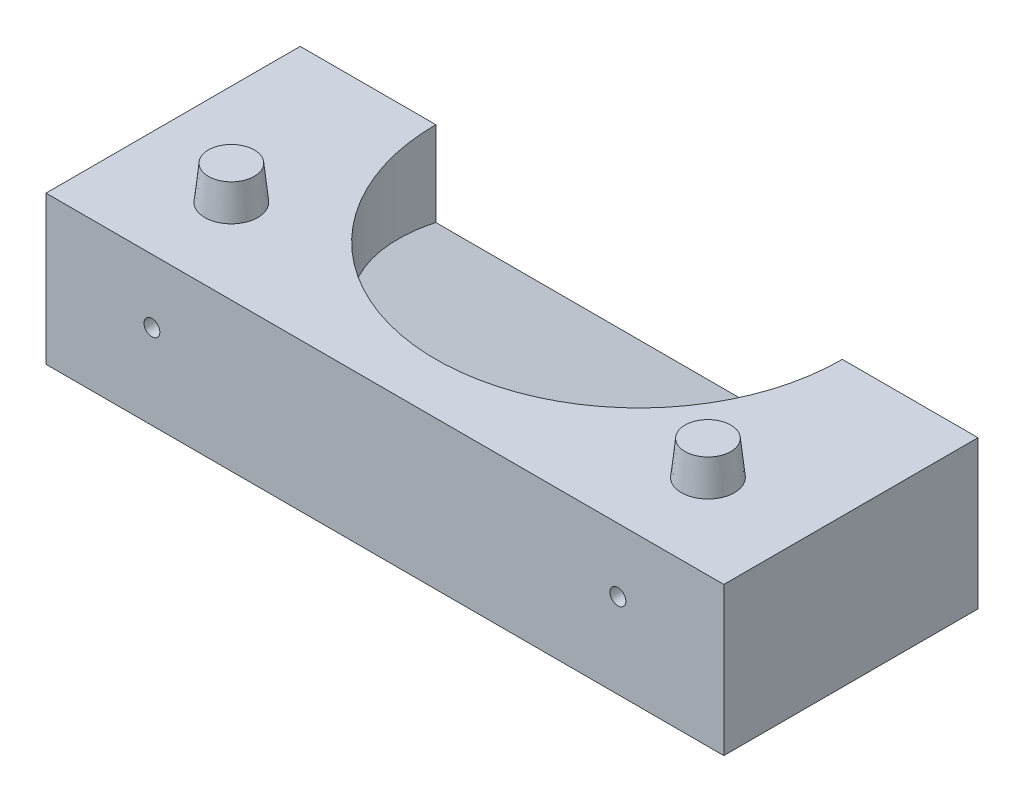
ISO-10303-21;
HEADER;
FILE_DESCRIPTION(('STEP AP214'),'2;1');
FILE_NAME('part.step','',(''),(''),'','','');
FILE_SCHEMA(('AUTOMOTIVE_DESIGN { 1 0 10303 214 1 1 1 1 }'));
ENDSEC;
DATA;
#1=APPLICATION_CONTEXT('core data for automotive mechanical design processes');
#2=APPLICATION_PROTOCOL_DEFINITION('international standard','automotive_design',2000,#1);
#3=PRODUCT_CONTEXT('',#1,'mechanical');
#4=PRODUCT('Part','Part','',(#3));
#5=PRODUCT_RELATED_PRODUCT_CATEGORY('part','',(#4));
#6=PRODUCT_DEFINITION_FORMATION('','',#4);
#7=PRODUCT_DEFINITION_CONTEXT('part definition',#1,'design');
#8=PRODUCT_DEFINITION('design','',#6,#7);
#9=PRODUCT_DEFINITION_SHAPE('','',#8);
#10=(LENGTH_UNIT() NAMED_UNIT(*) SI_UNIT(.MILLI.,.METRE.));
#11=(NAMED_UNIT(*) PLANE_ANGLE_UNIT() SI_UNIT($,.RADIAN.));
#12=(NAMED_UNIT(*) SI_UNIT($,.STERADIAN.) SOLID_ANGLE_UNIT());
#13=UNCERTAINTY_MEASURE_WITH_UNIT(LENGTH_MEASURE(1.E-05),#10,'distance_accuracy_value','');
#14=(GEOMETRIC_REPRESENTATION_CONTEXT(3) GLOBAL_UNCERTAINTY_ASSIGNED_CONTEXT((#13)) GLOBAL_UNIT_ASSIGNED_CONTEXT((#10,
#11,#12)) REPRESENTATION_CONTEXT('',''));
#15=CARTESIAN_POINT('',(0.,0.,0.));
#16=DIRECTION('',(0.,0.,1.));
#17=DIRECTION('',(1.,0.,0.));
#18=AXIS2_PLACEMENT_3D('',#15,#16,#17);
#19=CARTESIAN_POINT('',(-160.,0.,120.));
#20=DIRECTION('',(0.,-1.,0.));
#21=DIRECTION('',(0.,0.,-1.));
#22=AXIS2_PLACEMENT_3D('',#19,#20,#21);
#23=PLANE('',#22);
#24=CARTESIAN_POINT('',(112.5,0.,80.));
#25=DIRECTION('',(0.,-1.,0.));
#26=DIRECTION('',(0.,0.,-1.));
#27=AXIS2_PLACEMENT_3D('',#24,#25,#26);
#28=CIRCLE('',#27,12.5);
#29=CARTESIAN_POINT('',(112.5,0.,67.4999999999999));
#30=VERTEX_POINT('',#29);
#31=EDGE_CURVE('E11',#30,#30,#28,.F.);
#32=ORIENTED_EDGE('',*,*,#31,.F.);
#33=EDGE_LOOP('',(#32));
#34=FACE_BOUND('',#33,.T.);
#35=CARTESIAN_POINT('',(-112.5,0.,80.));
#36=DIRECTION('',(0.,-1.,0.));
#37=DIRECTION('',(0.,0.,-1.));
#38=AXIS2_PLACEMENT_3D('',#35,#36,#37);
#39=CIRCLE('',#38,12.5);
#40=CARTESIAN_POINT('',(-112.5,0.,67.5));
#41=VERTEX_POINT('',#40);
#42=EDGE_CURVE('E45',#41,#41,#39,.F.);
#43=ORIENTED_EDGE('',*,*,#42,.F.);
#44=EDGE_LOOP('',(#43));
#45=FACE_BOUND('',#44,.T.);
#46=DIRECTION('',(-1.,0.,0.));
#47=VECTOR('',#46,1.);
#48=CARTESIAN_POINT('',(-160.,0.,0.));
#49=LINE('',#48,#47);
#50=CARTESIAN_POINT('',(160.,0.,0.));
#51=VERTEX_POINT('',#50);
#52=CARTESIAN_POINT('',(95.959595959596,0.,0.));
#53=VERTEX_POINT('',#52);
#54=EDGE_CURVE('E136',#51,#53,#49,.T.);
#55=ORIENTED_EDGE('',*,*,#54,.T.);
#56=CARTESIAN_POINT('',(0.,0.,0.));
#57=DIRECTION('',(0.,1.,0.));
#58=DIRECTION('',(0.,0.,1.));
#59=AXIS2_PLACEMENT_3D('',#56,#57,#58);
#60=CIRCLE('',#59,95.959595959596);
#61=CARTESIAN_POINT('',(-95.959595959596,0.,0.));
#62=VERTEX_POINT('',#61);
#63=EDGE_CURVE('E60',#62,#53,#60,.T.);
#64=ORIENTED_EDGE('',*,*,#63,.F.);
#65=CARTESIAN_POINT('',(-160.,0.,0.));
#66=VERTEX_POINT('',#65);
#67=EDGE_CURVE('E138',#62,#66,#49,.T.);
#68=ORIENTED_EDGE('',*,*,#67,.T.);
#69=DIRECTION('',(0.,0.,-1.));
#70=VECTOR('',#69,1.);
#71=CARTESIAN_POINT('',(-160.,0.,120.));
#72=LINE('',#71,#70);
#73=CARTESIAN_POINT('',(-160.,0.,120.));
#74=VERTEX_POINT('',#73);
#75=EDGE_CURVE('E162',#74,#66,#72,.T.);
#76=ORIENTED_EDGE('',*,*,#75,.F.);
#77=DIRECTION('',(-1.,0.,0.));
#78=VECTOR('',#77,1.);
#79=CARTESIAN_POINT('',(-160.,0.,120.));
#80=LINE('',#79,#78);
#81=CARTESIAN_POINT('',(160.,0.,120.));
#82=VERTEX_POINT('',#81);
#83=EDGE_CURVE('E115',#82,#74,#80,.T.);
#84=ORIENTED_EDGE('',*,*,#83,.F.);
#85=DIRECTION('',(0.,0.,-1.));
#86=VECTOR('',#85,1.);
#87=CARTESIAN_POINT('',(160.,0.,120.));
#88=LINE('',#87,#86);
#89=EDGE_CURVE('E113',#82,#51,#88,.T.);
#90=ORIENTED_EDGE('',*,*,#89,.T.);
#91=EDGE_LOOP('',(#55,#64,#68,#76,#84,#90));
#92=FACE_BOUND('',#91,.T.);
#93=ADVANCED_FACE('F37',(#34,#45,#92),#23,.F.);
#94=CARTESIAN_POINT('',(0.,0.,0.));
#95=DIRECTION('',(0.,0.,-1.));
#96=DIRECTION('',(-1.,0.,0.));
#97=AXIS2_PLACEMENT_3D('',#94,#95,#96);
#98=PLANE('',#97);
#99=CARTESIAN_POINT('',(110.,-30.,0.));
#100=DIRECTION('',(0.,0.,-1.));
#101=DIRECTION('',(-1.,0.,0.));
#102=AXIS2_PLACEMENT_3D('',#99,#100,#101);
#103=CIRCLE('',#102,4.99999999999999);
#104=CARTESIAN_POINT('',(105.,-30.,0.));
#105=VERTEX_POINT('',#104);
#106=EDGE_CURVE('E201',#105,#105,#103,.T.);
#107=ORIENTED_EDGE('',*,*,#106,.F.);
#108=EDGE_LOOP('',(#107));
#109=FACE_BOUND('',#108,.T.);
#110=CARTESIAN_POINT('',(-110.,-30.,0.));
#111=DIRECTION('',(0.,0.,-1.));
#112=DIRECTION('',(-1.,0.,0.));
#113=AXIS2_PLACEMENT_3D('',#110,#111,#112);
#114=CIRCLE('',#113,4.99999999999999);
#115=CARTESIAN_POINT('',(-115.,-30.,0.));
#116=VERTEX_POINT('',#115);
#117=EDGE_CURVE('E189',#116,#116,#114,.T.);
#118=ORIENTED_EDGE('',*,*,#117,.F.);
#119=EDGE_LOOP('',(#118));
#120=FACE_BOUND('',#119,.T.);
#121=DIRECTION('',(0.,1.,0.));
#122=VECTOR('',#121,1.);
#123=CARTESIAN_POINT('',(-95.959595959596,-351.414724091806,0.));
#124=LINE('',#123,#122);
#125=CARTESIAN_POINT('',(-95.959595959596,-40.,0.));
#126=VERTEX_POINT('',#125);
#127=EDGE_CURVE('E52',#126,#62,#124,.T.);
#128=ORIENTED_EDGE('',*,*,#127,.F.);
#129=DIRECTION('',(1.,0.,0.));
#130=VECTOR('',#129,1.);
#131=CARTESIAN_POINT('',(98.989898989899,-40.,0.));
#132=LINE('',#131,#130);
#133=CARTESIAN_POINT('',(95.959595959596,-40.,0.));
#134=VERTEX_POINT('',#133);
#135=EDGE_CURVE('E67',#126,#134,#132,.T.);
#136=ORIENTED_EDGE('',*,*,#135,.T.);
#137=DIRECTION('',(0.,1.,0.));
#138=VECTOR('',#137,1.);
#139=CARTESIAN_POINT('',(95.959595959596,-351.414724091806,0.));
#140=LINE('',#139,#138);
#141=EDGE_CURVE('E126',#53,#134,#140,.F.);
#142=ORIENTED_EDGE('',*,*,#141,.F.);
#143=ORIENTED_EDGE('',*,*,#54,.F.);
#144=DIRECTION('',(0.,1.,0.));
#145=VECTOR('',#144,1.);
#146=CARTESIAN_POINT('',(160.,-70.,0.));
#147=LINE('',#146,#145);
#148=CARTESIAN_POINT('',(160.,-70.,0.));
#149=VERTEX_POINT('',#148);
#150=EDGE_CURVE('E109',#149,#51,#147,.T.);
#151=ORIENTED_EDGE('',*,*,#150,.F.);
#152=DIRECTION('',(1.,0.,0.));
#153=VECTOR('',#152,1.);
#154=CARTESIAN_POINT('',(-160.,-70.,0.));
#155=LINE('',#154,#153);
#156=CARTESIAN_POINT('',(-160.,-70.,0.));
#157=VERTEX_POINT('',#156);
#158=EDGE_CURVE('E106',#157,#149,#155,.T.);
#159=ORIENTED_EDGE('',*,*,#158,.F.);
#160=DIRECTION('',(0.,-1.,0.));
#161=VECTOR('',#160,1.);
#162=CARTESIAN_POINT('',(-160.,-70.,0.));
#163=LINE('',#162,#161);
#164=EDGE_CURVE('E133',#66,#157,#163,.T.);
#165=ORIENTED_EDGE('',*,*,#164,.F.);
#166=ORIENTED_EDGE('',*,*,#67,.F.);
#167=EDGE_LOOP('',(#128,#136,#142,#143,#151,#159,#165,#166));
#168=FACE_BOUND('',#167,.T.);
#169=CARTESIAN_POINT('',(-142.5,-50.,0.));
#170=DIRECTION('',(0.,0.,-1.));
#171=DIRECTION('',(-1.,0.,0.));
#172=AXIS2_PLACEMENT_3D('',#169,#170,#171);
#173=CIRCLE('',#172,10.);
#174=CARTESIAN_POINT('',(-152.5,-50.,0.));
#175=VERTEX_POINT('',#174);
#176=EDGE_CURVE('E123',#175,#175,#173,.F.);
#177=ORIENTED_EDGE('',*,*,#176,.T.);
#178=EDGE_LOOP('',(#177));
#179=FACE_BOUND('',#178,.T.);
#180=CARTESIAN_POINT('',(142.5,-50.,0.));
#181=DIRECTION('',(0.,0.,-1.));
#182=DIRECTION('',(-1.,0.,0.));
#183=AXIS2_PLACEMENT_3D('',#180,#181,#182);
#184=CIRCLE('',#183,10.);
#185=CARTESIAN_POINT('',(132.5,-50.,0.));
#186=VERTEX_POINT('',#185);
#187=EDGE_CURVE('E130',#186,#186,#184,.F.);
#188=ORIENTED_EDGE('',*,*,#187,.T.);
#189=EDGE_LOOP('',(#188));
#190=FACE_BOUND('',#189,.T.);
#191=ADVANCED_FACE('F147',(#109,#120,#168,#179,#190),#98,.T.);
#192=CARTESIAN_POINT('',(-160.,-70.,120.));
#193=DIRECTION('',(1.,0.,0.));
#194=DIRECTION('',(0.,0.,-1.));
#195=AXIS2_PLACEMENT_3D('',#192,#193,#194);
#196=PLANE('',#195);
#197=ORIENTED_EDGE('',*,*,#164,.T.);
#198=DIRECTION('',(0.,0.,-1.));
#199=VECTOR('',#198,1.);
#200=CARTESIAN_POINT('',(-160.,-70.,120.));
#201=LINE('',#200,#199);
#202=CARTESIAN_POINT('',(-160.,-70.,120.));
#203=VERTEX_POINT('',#202);
#204=EDGE_CURVE('E165',#203,#157,#201,.T.);
#205=ORIENTED_EDGE('',*,*,#204,.F.);
#206=DIRECTION('',(0.,-1.,0.));
#207=VECTOR('',#206,1.);
#208=CARTESIAN_POINT('',(-160.,-70.,120.));
#209=LINE('',#208,#207);
#210=EDGE_CURVE('E98',#74,#203,#209,.T.);
#211=ORIENTED_EDGE('',*,*,#210,.F.);
#212=ORIENTED_EDGE('',*,*,#75,.T.);
#213=EDGE_LOOP('',(#197,#205,#211,#212));
#214=FACE_BOUND('',#213,.T.);
#215=ADVANCED_FACE('F167',(#214),#196,.F.);
#216=CARTESIAN_POINT('',(-160.,-70.,120.));
#217=DIRECTION('',(0.,1.,0.));
#218=DIRECTION('',(0.,0.,1.));
#219=AXIS2_PLACEMENT_3D('',#216,#217,#218);
#220=PLANE('',#219);
#221=ORIENTED_EDGE('',*,*,#158,.T.);
#222=DIRECTION('',(0.,0.,-1.));
#223=VECTOR('',#222,1.);
#224=CARTESIAN_POINT('',(160.,-70.,120.));
#225=LINE('',#224,#223);
#226=CARTESIAN_POINT('',(160.,-70.,120.));
#227=VERTEX_POINT('',#226);
#228=EDGE_CURVE('E104',#227,#149,#225,.T.);
#229=ORIENTED_EDGE('',*,*,#228,.F.);
#230=DIRECTION('',(1.,0.,0.));
#231=VECTOR('',#230,1.);
#232=CARTESIAN_POINT('',(-160.,-70.,120.));
#233=LINE('',#232,#231);
#234=EDGE_CURVE('E91',#203,#227,#233,.T.);
#235=ORIENTED_EDGE('',*,*,#234,.F.);
#236=ORIENTED_EDGE('',*,*,#204,.T.);
#237=EDGE_LOOP('',(#221,#229,#235,#236));
#238=FACE_BOUND('',#237,.T.);
#239=ADVANCED_FACE('F105',(#238),#220,.F.);
#240=CARTESIAN_POINT('',(160.,-70.,120.));
#241=DIRECTION('',(-1.,0.,0.));
#242=DIRECTION('',(0.,0.,1.));
#243=AXIS2_PLACEMENT_3D('',#240,#241,#242);
#244=PLANE('',#243);
#245=ORIENTED_EDGE('',*,*,#150,.T.);
#246=ORIENTED_EDGE('',*,*,#89,.F.);
#247=DIRECTION('',(0.,1.,0.));
#248=VECTOR('',#247,1.);
#249=CARTESIAN_POINT('',(160.,-70.,120.));
#250=LINE('',#249,#248);
#251=EDGE_CURVE('E95',#227,#82,#250,.T.);
#252=ORIENTED_EDGE('',*,*,#251,.F.);
#253=ORIENTED_EDGE('',*,*,#228,.T.);
#254=EDGE_LOOP('',(#245,#246,#252,#253));
#255=FACE_BOUND('',#254,.T.);
#256=ADVANCED_FACE('F111',(#255),#244,.F.);
#257=CARTESIAN_POINT('',(0.,0.,120.));
#258=DIRECTION('',(0.,0.,-1.));
#259=DIRECTION('',(-1.,0.,0.));
#260=AXIS2_PLACEMENT_3D('',#257,#258,#259);
#261=PLANE('',#260);
#262=CARTESIAN_POINT('',(110.,-30.,120.));
#263=DIRECTION('',(0.,0.,-1.));
#264=DIRECTION('',(-1.,0.,0.));
#265=AXIS2_PLACEMENT_3D('',#262,#263,#264);
#266=CIRCLE('',#265,3.74999999999998);
#267=CARTESIAN_POINT('',(106.25,-30.,120.));
#268=VERTEX_POINT('',#267);
#269=EDGE_CURVE('E192',#268,#268,#266,.T.);
#270=ORIENTED_EDGE('',*,*,#269,.T.);
#271=EDGE_LOOP('',(#270));
#272=FACE_BOUND('',#271,.T.);
#273=CARTESIAN_POINT('',(-110.,-30.,120.));
#274=DIRECTION('',(0.,0.,-1.));
#275=DIRECTION('',(-1.,0.,0.));
#276=AXIS2_PLACEMENT_3D('',#273,#274,#275);
#277=CIRCLE('',#276,3.74999999999998);
#278=CARTESIAN_POINT('',(-113.75,-30.,120.));
#279=VERTEX_POINT('',#278);
#280=EDGE_CURVE('E180',#279,#279,#277,.T.);
#281=ORIENTED_EDGE('',*,*,#280,.T.);
#282=EDGE_LOOP('',(#281));
#283=FACE_BOUND('',#282,.T.);
#284=ORIENTED_EDGE('',*,*,#210,.T.);
#285=ORIENTED_EDGE('',*,*,#234,.T.);
#286=ORIENTED_EDGE('',*,*,#251,.T.);
#287=ORIENTED_EDGE('',*,*,#83,.T.);
#288=EDGE_LOOP('',(#284,#285,#286,#287));
#289=FACE_BOUND('',#288,.T.);
#290=ADVANCED_FACE('F93',(#272,#283,#289),#261,.F.);
#291=CARTESIAN_POINT('',(142.5,-50.,0.));
#292=DIRECTION('',(0.,0.,-1.));
#293=DIRECTION('',(1.,0.,0.));
#294=AXIS2_PLACEMENT_3D('',#291,#292,#293);
#295=CONICAL_SURFACE('',#294,10.,0.10471975511966);
#296=ORIENTED_EDGE('',*,*,#187,.F.);
#297=EDGE_LOOP('',(#296));
#298=FACE_BOUND('',#297,.T.);
#299=CARTESIAN_POINT('',(142.5,-50.,18.));
#300=DIRECTION('',(0.,0.,-1.));
#301=DIRECTION('',(-1.,0.,0.));
#302=AXIS2_PLACEMENT_3D('',#299,#300,#301);
#303=CIRCLE('',#302,8.10812376521784);
#304=CARTESIAN_POINT('',(134.391876234782,-50.,18.));
#305=VERTEX_POINT('',#304);
#306=EDGE_CURVE('E169',#305,#305,#303,.T.);
#307=ORIENTED_EDGE('',*,*,#306,.F.);
#308=EDGE_LOOP('',(#307));
#309=FACE_BOUND('',#308,.T.);
#310=ADVANCED_FACE('F264',(#298,#309),#295,.F.);
#311=CARTESIAN_POINT('',(-142.5,-50.,0.));
#312=DIRECTION('',(0.,0.,-1.));
#313=DIRECTION('',(1.,0.,0.));
#314=AXIS2_PLACEMENT_3D('',#311,#312,#313);
#315=CONICAL_SURFACE('',#314,10.,0.10471975511966);
#316=ORIENTED_EDGE('',*,*,#176,.F.);
#317=EDGE_LOOP('',(#316));
#318=FACE_BOUND('',#317,.T.);
#319=CARTESIAN_POINT('',(-142.5,-50.,18.));
#320=DIRECTION('',(0.,0.,-1.));
#321=DIRECTION('',(-1.,0.,0.));
#322=AXIS2_PLACEMENT_3D('',#319,#320,#321);
#323=CIRCLE('',#322,8.10812376521784);
#324=CARTESIAN_POINT('',(-150.608123765218,-50.,18.));
#325=VERTEX_POINT('',#324);
#326=EDGE_CURVE('E139',#325,#325,#323,.T.);
#327=ORIENTED_EDGE('',*,*,#326,.F.);
#328=EDGE_LOOP('',(#327));
#329=FACE_BOUND('',#328,.T.);
#330=ADVANCED_FACE('F268',(#318,#329),#315,.F.);
#331=CARTESIAN_POINT('',(98.989898989899,-40.,0.));
#332=DIRECTION('',(0.,-0.978147600733806,0.20791169081776));
#333=DIRECTION('',(0.,-0.20791169081776,-0.978147600733806));
#334=AXIS2_PLACEMENT_3D('',#331,#332,#333);
#335=PLANE('',#334);
#336=CARTESIAN_POINT('',(0.,-40.,0.));
#337=DIRECTION('',(0.,-0.978147600733806,0.20791169081776));
#338=DIRECTION('',(0.,0.20791169081776,0.978147600733806));
#339=AXIS2_PLACEMENT_3D('',#336,#337,#338);
#340=ELLIPSE('',#339,98.1033904163412,95.959595959596);
#341=EDGE_CURVE('E124',#134,#126,#340,.T.);
#342=ORIENTED_EDGE('',*,*,#341,.F.);
#343=ORIENTED_EDGE('',*,*,#135,.F.);
#344=EDGE_LOOP('',(#342,#343));
#345=FACE_BOUND('',#344,.T.);
#346=ADVANCED_FACE('F154',(#345),#335,.F.);
#347=CARTESIAN_POINT('',(0.,-351.414724091806,0.));
#348=DIRECTION('',(0.,1.,0.));
#349=DIRECTION('',(0.,0.,1.));
#350=AXIS2_PLACEMENT_3D('',#347,#348,#349);
#351=CYLINDRICAL_SURFACE('',#350,95.959595959596);
#352=ORIENTED_EDGE('',*,*,#63,.T.);
#353=ORIENTED_EDGE('',*,*,#141,.T.);
#354=ORIENTED_EDGE('',*,*,#341,.T.);
#355=ORIENTED_EDGE('',*,*,#127,.T.);
#356=EDGE_LOOP('',(#352,#353,#354,#355));
#357=FACE_BOUND('',#356,.T.);
#358=ADVANCED_FACE('F152',(#357),#351,.F.);
#359=CARTESIAN_POINT('',(-142.5,-50.,18.));
#360=DIRECTION('',(0.,0.,-1.));
#361=DIRECTION('',(-1.,0.,0.));
#362=AXIS2_PLACEMENT_3D('',#359,#360,#361);
#363=PLANE('',#362);
#364=ORIENTED_EDGE('',*,*,#326,.T.);
#365=EDGE_LOOP('',(#364));
#366=FACE_BOUND('',#365,.T.);
#367=ADVANCED_FACE('F249',(#366),#363,.T.);
#368=CARTESIAN_POINT('',(142.5,-50.,18.));
#369=DIRECTION('',(0.,0.,-1.));
#370=DIRECTION('',(-1.,0.,0.));
#371=AXIS2_PLACEMENT_3D('',#368,#369,#370);
#372=PLANE('',#371);
#373=ORIENTED_EDGE('',*,*,#306,.T.);
#374=EDGE_LOOP('',(#373));
#375=FACE_BOUND('',#374,.T.);
#376=ADVANCED_FACE('F247',(#375),#372,.T.);
#377=CARTESIAN_POINT('',(-112.5,0.,80.));
#378=DIRECTION('',(0.,-1.,0.));
#379=DIRECTION('',(0.,0.,1.));
#380=AXIS2_PLACEMENT_3D('',#377,#378,#379);
#381=CONICAL_SURFACE('',#380,12.5,0.10471975511966);
#382=CARTESIAN_POINT('',(-112.5,16.,80.));
#383=DIRECTION('',(0.,1.,0.));
#384=DIRECTION('',(0.,0.,1.));
#385=AXIS2_PLACEMENT_3D('',#382,#383,#384);
#386=CIRCLE('',#385,10.8183322357492);
#387=CARTESIAN_POINT('',(-112.5,16.,90.8183322357492));
#388=VERTEX_POINT('',#387);
#389=EDGE_CURVE('E172',#388,#388,#386,.T.);
#390=ORIENTED_EDGE('',*,*,#389,.F.);
#391=EDGE_LOOP('',(#390));
#392=FACE_BOUND('',#391,.T.);
#393=ORIENTED_EDGE('',*,*,#42,.T.);
#394=EDGE_LOOP('',(#393));
#395=FACE_BOUND('',#394,.T.);
#396=ADVANCED_FACE('F143',(#392,#395),#381,.T.);
#397=CARTESIAN_POINT('',(-112.5,16.,80.));
#398=DIRECTION('',(0.,1.,0.));
#399=DIRECTION('',(0.,0.,1.));
#400=AXIS2_PLACEMENT_3D('',#397,#398,#399);
#401=PLANE('',#400);
#402=ORIENTED_EDGE('',*,*,#389,.T.);
#403=EDGE_LOOP('',(#402));
#404=FACE_BOUND('',#403,.T.);
#405=ADVANCED_FACE('F240',(#404),#401,.T.);
#406=CARTESIAN_POINT('',(112.5,0.,80.));
#407=DIRECTION('',(0.,-1.,0.));
#408=DIRECTION('',(0.,0.,1.));
#409=AXIS2_PLACEMENT_3D('',#406,#407,#408);
#410=CONICAL_SURFACE('',#409,12.5,0.10471975511966);
#411=CARTESIAN_POINT('',(112.5,16.,80.));
#412=DIRECTION('',(0.,1.,0.));
#413=DIRECTION('',(0.,0.,1.));
#414=AXIS2_PLACEMENT_3D('',#411,#412,#413);
#415=CIRCLE('',#414,10.8183322357492);
#416=CARTESIAN_POINT('',(112.5,16.,90.8183322357491));
#417=VERTEX_POINT('',#416);
#418=EDGE_CURVE('E177',#417,#417,#415,.T.);
#419=ORIENTED_EDGE('',*,*,#418,.F.);
#420=EDGE_LOOP('',(#419));
#421=FACE_BOUND('',#420,.T.);
#422=ORIENTED_EDGE('',*,*,#31,.T.);
#423=EDGE_LOOP('',(#422));
#424=FACE_BOUND('',#423,.T.);
#425=ADVANCED_FACE('F236',(#421,#424),#410,.T.);
#426=CARTESIAN_POINT('',(112.5,16.,80.));
#427=DIRECTION('',(0.,1.,0.));
#428=DIRECTION('',(0.,0.,1.));
#429=AXIS2_PLACEMENT_3D('',#426,#427,#428);
#430=PLANE('',#429);
#431=ORIENTED_EDGE('',*,*,#418,.T.);
#432=EDGE_LOOP('',(#431));
#433=FACE_BOUND('',#432,.T.);
#434=ADVANCED_FACE('F232',(#433),#430,.T.);
#435=CARTESIAN_POINT('',(-110.,-30.,0.));
#436=DIRECTION('',(0.,0.,-1.));
#437=DIRECTION('',(-1.,0.,0.));
#438=AXIS2_PLACEMENT_3D('',#435,#436,#437);
#439=CYLINDRICAL_SURFACE('',#438,3.75);
#440=ORIENTED_EDGE('',*,*,#280,.F.);
#441=EDGE_LOOP('',(#440));
#442=FACE_BOUND('',#441,.T.);
#443=CARTESIAN_POINT('',(-110.,-30.,8.));
#444=DIRECTION('',(0.,0.,-1.));
#445=DIRECTION('',(-1.,0.,0.));
#446=AXIS2_PLACEMENT_3D('',#443,#444,#445);
#447=CIRCLE('',#446,3.75000000000002);
#448=CARTESIAN_POINT('',(-113.75,-30.,8.));
#449=VERTEX_POINT('',#448);
#450=EDGE_CURVE('E183',#449,#449,#447,.T.);
#451=ORIENTED_EDGE('',*,*,#450,.T.);
#452=EDGE_LOOP('',(#451));
#453=FACE_BOUND('',#452,.T.);
#454=ADVANCED_FACE('F224',(#442,#453),#439,.F.);
#455=CARTESIAN_POINT('',(-106.25,-30.,8.));
#456=DIRECTION('',(0.,0.,1.));
#457=DIRECTION('',(1.,0.,0.));
#458=AXIS2_PLACEMENT_3D('',#455,#456,#457);
#459=PLANE('',#458);
#460=ORIENTED_EDGE('',*,*,#450,.F.);
#461=EDGE_LOOP('',(#460));
#462=FACE_BOUND('',#461,.T.);
#463=CARTESIAN_POINT('',(-110.,-30.,8.));
#464=DIRECTION('',(0.,0.,-1.));
#465=DIRECTION('',(-1.,0.,0.));
#466=AXIS2_PLACEMENT_3D('',#463,#464,#465);
#467=CIRCLE('',#466,4.99999999999999);
#468=CARTESIAN_POINT('',(-115.,-30.,8.));
#469=VERTEX_POINT('',#468);
#470=EDGE_CURVE('E186',#469,#469,#467,.T.);
#471=ORIENTED_EDGE('',*,*,#470,.T.);
#472=EDGE_LOOP('',(#471));
#473=FACE_BOUND('',#472,.T.);
#474=ADVANCED_FACE('F214',(#462,#473),#459,.F.);
#475=CARTESIAN_POINT('',(-110.,-30.,0.));
#476=DIRECTION('',(0.,0.,-1.));
#477=DIRECTION('',(-1.,0.,0.));
#478=AXIS2_PLACEMENT_3D('',#475,#476,#477);
#479=CYLINDRICAL_SURFACE('',#478,4.99999999999999);
#480=ORIENTED_EDGE('',*,*,#470,.F.);
#481=EDGE_LOOP('',(#480));
#482=FACE_BOUND('',#481,.T.);
#483=ORIENTED_EDGE('',*,*,#117,.T.);
#484=EDGE_LOOP('',(#483));
#485=FACE_BOUND('',#484,.T.);
#486=ADVANCED_FACE('F211',(#482,#485),#479,.F.);
#487=CARTESIAN_POINT('',(110.,-30.,0.));
#488=DIRECTION('',(0.,0.,-1.));
#489=DIRECTION('',(-1.,0.,0.));
#490=AXIS2_PLACEMENT_3D('',#487,#488,#489);
#491=CYLINDRICAL_SURFACE('',#490,3.75);
#492=ORIENTED_EDGE('',*,*,#269,.F.);
#493=EDGE_LOOP('',(#492));
#494=FACE_BOUND('',#493,.T.);
#495=CARTESIAN_POINT('',(110.,-30.,8.));
#496=DIRECTION('',(0.,0.,-1.));
#497=DIRECTION('',(-1.,0.,0.));
#498=AXIS2_PLACEMENT_3D('',#495,#496,#497);
#499=CIRCLE('',#498,3.75000000000002);
#500=CARTESIAN_POINT('',(106.25,-30.,8.));
#501=VERTEX_POINT('',#500);
#502=EDGE_CURVE('E195',#501,#501,#499,.T.);
#503=ORIENTED_EDGE('',*,*,#502,.T.);
#504=EDGE_LOOP('',(#503));
#505=FACE_BOUND('',#504,.T.);
#506=ADVANCED_FACE('F213',(#494,#505),#491,.F.);
#507=CARTESIAN_POINT('',(113.75,-30.,8.));
#508=DIRECTION('',(0.,0.,1.));
#509=DIRECTION('',(1.,0.,0.));
#510=AXIS2_PLACEMENT_3D('',#507,#508,#509);
#511=PLANE('',#510);
#512=ORIENTED_EDGE('',*,*,#502,.F.);
#513=EDGE_LOOP('',(#512));
#514=FACE_BOUND('',#513,.T.);
#515=CARTESIAN_POINT('',(110.,-30.,8.));
#516=DIRECTION('',(0.,0.,-1.));
#517=DIRECTION('',(-1.,0.,0.));
#518=AXIS2_PLACEMENT_3D('',#515,#516,#517);
#519=CIRCLE('',#518,4.99999999999999);
#520=CARTESIAN_POINT('',(105.,-30.,8.));
#521=VERTEX_POINT('',#520);
#522=EDGE_CURVE('E198',#521,#521,#519,.T.);
#523=ORIENTED_EDGE('',*,*,#522,.T.);
#524=EDGE_LOOP('',(#523));
#525=FACE_BOUND('',#524,.T.);
#526=ADVANCED_FACE('F221',(#514,#525),#511,.F.);
#527=CARTESIAN_POINT('',(110.,-30.,0.));
#528=DIRECTION('',(0.,0.,-1.));
#529=DIRECTION('',(-1.,0.,0.));
#530=AXIS2_PLACEMENT_3D('',#527,#528,#529);
#531=CYLINDRICAL_SURFACE('',#530,4.99999999999999);
#532=ORIENTED_EDGE('',*,*,#522,.F.);
#533=EDGE_LOOP('',(#532));
#534=FACE_BOUND('',#533,.T.);
#535=ORIENTED_EDGE('',*,*,#106,.T.);
#536=EDGE_LOOP('',(#535));
#537=FACE_BOUND('',#536,.T.);
#538=ADVANCED_FACE('F205',(#534,#537),#531,.F.);
#539=CLOSED_SHELL('',(#93,#191,#215,#239,#256,#290,#310,#330,#346,#358,#367,#376,#396,#405,#425,
#434,#454,#474,#486,#506,#526,#538));
#540=MANIFOLD_SOLID_BREP('B2',#539);
#541=ADVANCED_BREP_SHAPE_REPRESENTATION('',(#18,#540),#14);
#542=SHAPE_DEFINITION_REPRESENTATION(#9,#541);
ENDSEC;
END-ISO-10303-21;
